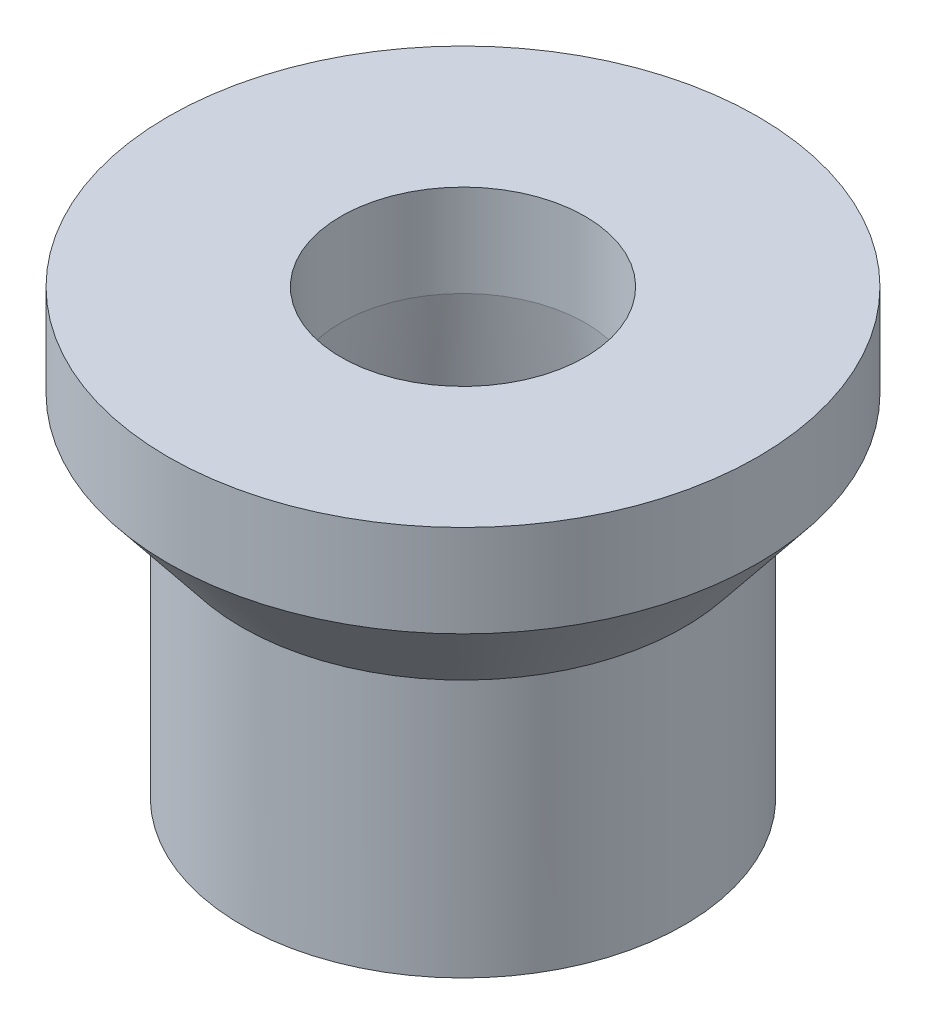
ISO-10303-21;
HEADER;
FILE_DESCRIPTION(('STEP AP214'),'2;1');
FILE_NAME('part.step','',(''),(''),'','','');
FILE_SCHEMA(('AUTOMOTIVE_DESIGN { 1 0 10303 214 1 1 1 1 }'));
ENDSEC;
DATA;
#1=APPLICATION_CONTEXT('core data for automotive mechanical design processes');
#2=APPLICATION_PROTOCOL_DEFINITION('international standard','automotive_design',2000,#1);
#3=PRODUCT_CONTEXT('',#1,'mechanical');
#4=PRODUCT('Part','Part','',(#3));
#5=PRODUCT_RELATED_PRODUCT_CATEGORY('part','',(#4));
#6=PRODUCT_DEFINITION_FORMATION('','',#4);
#7=PRODUCT_DEFINITION_CONTEXT('part definition',#1,'design');
#8=PRODUCT_DEFINITION('design','',#6,#7);
#9=PRODUCT_DEFINITION_SHAPE('','',#8);
#10=(LENGTH_UNIT() NAMED_UNIT(*) SI_UNIT(.MILLI.,.METRE.));
#11=(NAMED_UNIT(*) PLANE_ANGLE_UNIT() SI_UNIT($,.RADIAN.));
#12=(NAMED_UNIT(*) SI_UNIT($,.STERADIAN.) SOLID_ANGLE_UNIT());
#13=UNCERTAINTY_MEASURE_WITH_UNIT(LENGTH_MEASURE(1.E-05),#10,'distance_accuracy_value','');
#14=(GEOMETRIC_REPRESENTATION_CONTEXT(3) GLOBAL_UNCERTAINTY_ASSIGNED_CONTEXT((#13)) GLOBAL_UNIT_ASSIGNED_CONTEXT((#10,
#11,#12)) REPRESENTATION_CONTEXT('',''));
#15=CARTESIAN_POINT('',(0.,0.,0.));
#16=DIRECTION('',(0.,0.,1.));
#17=DIRECTION('',(1.,0.,0.));
#18=AXIS2_PLACEMENT_3D('',#15,#16,#17);
#19=CARTESIAN_POINT('',(0.,0.,0.));
#20=DIRECTION('',(0.,-1.,0.));
#21=DIRECTION('',(0.,0.,-1.));
#22=AXIS2_PLACEMENT_3D('',#19,#20,#21);
#23=CYLINDRICAL_SURFACE('',#22,6.0000000000001);
#24=CARTESIAN_POINT('',(0.,0.,0.));
#25=DIRECTION('',(0.,-1.,0.));
#26=DIRECTION('',(0.,0.,-1.));
#27=AXIS2_PLACEMENT_3D('',#24,#25,#26);
#28=CIRCLE('',#27,6.0000000000001);
#29=CARTESIAN_POINT('',(0.,0.,-6.0000000000001));
#30=VERTEX_POINT('',#29);
#31=EDGE_CURVE('E18',#30,#30,#28,.T.);
#32=ORIENTED_EDGE('',*,*,#31,.F.);
#33=EDGE_LOOP('',(#32));
#34=FACE_BOUND('',#33,.T.);
#35=CARTESIAN_POINT('',(0.,7.00000000001603,0.));
#36=DIRECTION('',(0.,1.,0.));
#37=DIRECTION('',(0.,0.,1.));
#38=AXIS2_PLACEMENT_3D('',#35,#36,#37);
#39=CIRCLE('',#38,6.00000000001486);
#40=CARTESIAN_POINT('',(0.,7.00000000001603,6.00000000001486));
#41=VERTEX_POINT('',#40);
#42=EDGE_CURVE('E30',#41,#41,#39,.T.);
#43=ORIENTED_EDGE('',*,*,#42,.F.);
#44=EDGE_LOOP('',(#43));
#45=FACE_BOUND('',#44,.T.);
#46=ADVANCED_FACE('F15',(#34,#45),#23,.T.);
#47=CARTESIAN_POINT('',(5.99999999999998,0.,0.));
#48=DIRECTION('',(0.,-1.,0.));
#49=DIRECTION('',(0.,0.,-1.));
#50=AXIS2_PLACEMENT_3D('',#47,#48,#49);
#51=PLANE('',#50);
#52=ORIENTED_EDGE('',*,*,#31,.T.);
#53=EDGE_LOOP('',(#52));
#54=FACE_BOUND('',#53,.T.);
#55=CARTESIAN_POINT('',(0.,0.,0.));
#56=DIRECTION('',(0.,-1.,0.));
#57=DIRECTION('',(0.,0.,-1.));
#58=AXIS2_PLACEMENT_3D('',#55,#56,#57);
#59=CIRCLE('',#58,4.49999999999307);
#60=CARTESIAN_POINT('',(0.,0.,-4.49999999999307));
#61=VERTEX_POINT('',#60);
#62=EDGE_CURVE('E32',#61,#61,#59,.F.);
#63=ORIENTED_EDGE('',*,*,#62,.T.);
#64=EDGE_LOOP('',(#63));
#65=FACE_BOUND('',#64,.T.);
#66=ADVANCED_FACE('F44',(#54,#65),#51,.T.);
#67=CARTESIAN_POINT('',(0.,9.5,0.));
#68=DIRECTION('',(0.,1.,0.));
#69=DIRECTION('',(-1.,0.,0.));
#70=AXIS2_PLACEMENT_3D('',#67,#68,#69);
#71=CONICAL_SURFACE('',#70,8.00000000000204,0.674740942223553);
#72=CARTESIAN_POINT('',(0.,9.5,0.));
#73=DIRECTION('',(0.,-1.,0.));
#74=DIRECTION('',(0.,0.,-1.));
#75=AXIS2_PLACEMENT_3D('',#72,#73,#74);
#76=CIRCLE('',#75,8.00000000000013);
#77=CARTESIAN_POINT('',(0.,9.5,-8.00000000000013));
#78=VERTEX_POINT('',#77);
#79=EDGE_CURVE('E34',#78,#78,#76,.F.);
#80=ORIENTED_EDGE('',*,*,#79,.F.);
#81=EDGE_LOOP('',(#80));
#82=FACE_BOUND('',#81,.T.);
#83=ORIENTED_EDGE('',*,*,#42,.T.);
#84=EDGE_LOOP('',(#83));
#85=FACE_BOUND('',#84,.T.);
#86=ADVANCED_FACE('F52',(#82,#85),#71,.T.);
#87=CARTESIAN_POINT('',(0.,1.70530256582424E-10,0.));
#88=DIRECTION('',(0.,-1.,0.));
#89=DIRECTION('',(0.,0.,-1.));
#90=AXIS2_PLACEMENT_3D('',#87,#88,#89);
#91=CONICAL_SURFACE('',#90,4.49999999997175,0.124354994547498);
#92=ORIENTED_EDGE('',*,*,#62,.F.);
#93=EDGE_LOOP('',(#92));
#94=FACE_BOUND('',#93,.T.);
#95=CARTESIAN_POINT('',(0.,9.5,0.));
#96=DIRECTION('',(0.,-1.,0.));
#97=DIRECTION('',(0.,0.,-1.));
#98=AXIS2_PLACEMENT_3D('',#95,#96,#97);
#99=CIRCLE('',#98,3.31250000000005);
#100=CARTESIAN_POINT('',(0.,9.5,-3.31250000000005));
#101=VERTEX_POINT('',#100);
#102=EDGE_CURVE('E27',#101,#101,#99,.F.);
#103=ORIENTED_EDGE('',*,*,#102,.T.);
#104=EDGE_LOOP('',(#103));
#105=FACE_BOUND('',#104,.T.);
#106=ADVANCED_FACE('F67',(#94,#105),#91,.F.);
#107=CARTESIAN_POINT('',(0.,0.,0.));
#108=DIRECTION('',(0.,-1.,0.));
#109=DIRECTION('',(0.,0.,-1.));
#110=AXIS2_PLACEMENT_3D('',#107,#108,#109);
#111=CYLINDRICAL_SURFACE('',#110,8.00000000000013);
#112=ORIENTED_EDGE('',*,*,#79,.T.);
#113=EDGE_LOOP('',(#112));
#114=FACE_BOUND('',#113,.T.);
#115=CARTESIAN_POINT('',(0.,12.,0.));
#116=DIRECTION('',(0.,-1.,0.));
#117=DIRECTION('',(0.,0.,-1.));
#118=AXIS2_PLACEMENT_3D('',#115,#116,#117);
#119=CIRCLE('',#118,8.00000000000013);
#120=CARTESIAN_POINT('',(0.,12.,-8.00000000000013));
#121=VERTEX_POINT('',#120);
#122=EDGE_CURVE('E22',#121,#121,#119,.F.);
#123=ORIENTED_EDGE('',*,*,#122,.F.);
#124=EDGE_LOOP('',(#123));
#125=FACE_BOUND('',#124,.T.);
#126=ADVANCED_FACE('F60',(#114,#125),#111,.T.);
#127=CARTESIAN_POINT('',(0.,12.,0.));
#128=DIRECTION('',(0.,-1.,0.));
#129=DIRECTION('',(0.,0.,-1.));
#130=AXIS2_PLACEMENT_3D('',#127,#128,#129);
#131=CYLINDRICAL_SURFACE('',#130,3.31250000000005);
#132=ORIENTED_EDGE('',*,*,#102,.F.);
#133=EDGE_LOOP('',(#132));
#134=FACE_BOUND('',#133,.T.);
#135=CARTESIAN_POINT('',(0.,12.,0.));
#136=DIRECTION('',(0.,-1.,0.));
#137=DIRECTION('',(0.,0.,-1.));
#138=AXIS2_PLACEMENT_3D('',#135,#136,#137);
#139=CIRCLE('',#138,3.31250000000005);
#140=CARTESIAN_POINT('',(0.,12.,-3.31250000000005));
#141=VERTEX_POINT('',#140);
#142=EDGE_CURVE('E10',#141,#141,#139,.T.);
#143=ORIENTED_EDGE('',*,*,#142,.F.);
#144=EDGE_LOOP('',(#143));
#145=FACE_BOUND('',#144,.T.);
#146=ADVANCED_FACE('F55',(#134,#145),#131,.F.);
#147=CARTESIAN_POINT('',(0.,12.,0.));
#148=DIRECTION('',(0.,1.,0.));
#149=DIRECTION('',(0.,0.,1.));
#150=AXIS2_PLACEMENT_3D('',#147,#148,#149);
#151=PLANE('',#150);
#152=ORIENTED_EDGE('',*,*,#142,.T.);
#153=EDGE_LOOP('',(#152));
#154=FACE_BOUND('',#153,.T.);
#155=ORIENTED_EDGE('',*,*,#122,.T.);
#156=EDGE_LOOP('',(#155));
#157=FACE_BOUND('',#156,.T.);
#158=ADVANCED_FACE('F53',(#154,#157),#151,.T.);
#159=CLOSED_SHELL('',(#46,#66,#86,#106,#126,#146,#158));
#160=MANIFOLD_SOLID_BREP('B1',#159);
#161=ADVANCED_BREP_SHAPE_REPRESENTATION('',(#18,#160),#14);
#162=SHAPE_DEFINITION_REPRESENTATION(#9,#161);
ENDSEC;
END-ISO-10303-21;
